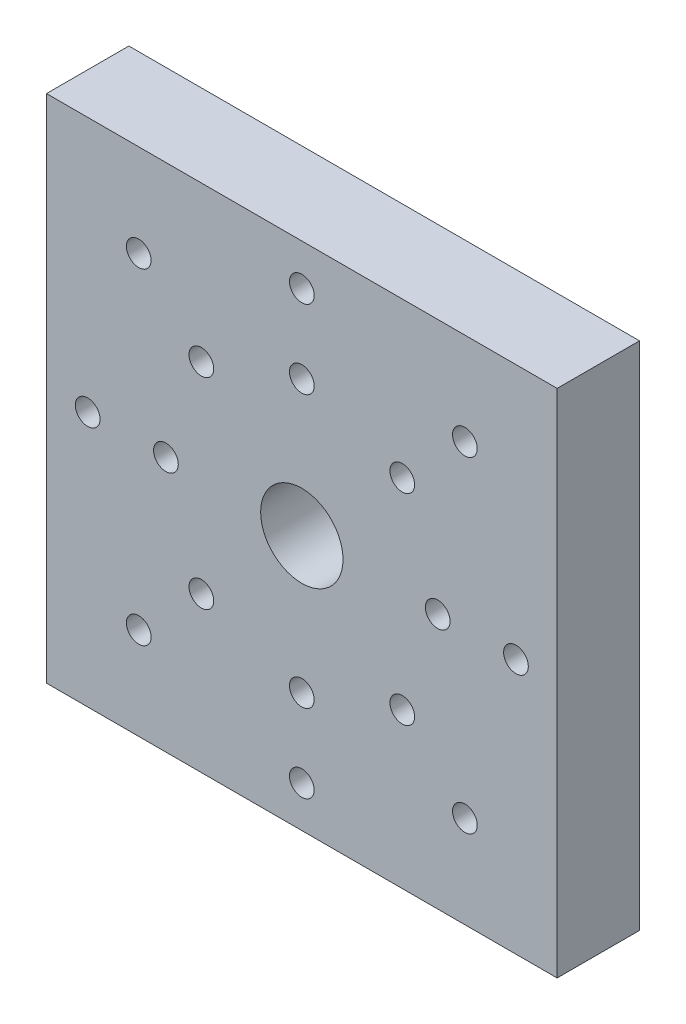
ISO-10303-21;
HEADER;
FILE_DESCRIPTION(('STEP AP214'),'2;1');
FILE_NAME('part.step','',(''),(''),'','','');
FILE_SCHEMA(('AUTOMOTIVE_DESIGN { 1 0 10303 214 1 1 1 1 }'));
ENDSEC;
DATA;
#1=APPLICATION_CONTEXT('core data for automotive mechanical design processes');
#2=APPLICATION_PROTOCOL_DEFINITION('international standard','automotive_design',2000,#1);
#3=PRODUCT_CONTEXT('',#1,'mechanical');
#4=PRODUCT('Part','Part','',(#3));
#5=PRODUCT_RELATED_PRODUCT_CATEGORY('part','',(#4));
#6=PRODUCT_DEFINITION_FORMATION('','',#4);
#7=PRODUCT_DEFINITION_CONTEXT('part definition',#1,'design');
#8=PRODUCT_DEFINITION('design','',#6,#7);
#9=PRODUCT_DEFINITION_SHAPE('','',#8);
#10=(LENGTH_UNIT() NAMED_UNIT(*) SI_UNIT(.MILLI.,.METRE.));
#11=(NAMED_UNIT(*) PLANE_ANGLE_UNIT() SI_UNIT($,.RADIAN.));
#12=(NAMED_UNIT(*) SI_UNIT($,.STERADIAN.) SOLID_ANGLE_UNIT());
#13=UNCERTAINTY_MEASURE_WITH_UNIT(LENGTH_MEASURE(1.E-05),#10,'distance_accuracy_value','');
#14=(GEOMETRIC_REPRESENTATION_CONTEXT(3) GLOBAL_UNCERTAINTY_ASSIGNED_CONTEXT((#13)) GLOBAL_UNIT_ASSIGNED_CONTEXT((#10,
#11,#12)) REPRESENTATION_CONTEXT('',''));
#15=CARTESIAN_POINT('',(0.,0.,0.));
#16=DIRECTION('',(0.,0.,1.));
#17=DIRECTION('',(1.,0.,0.));
#18=AXIS2_PLACEMENT_3D('',#15,#16,#17);
#19=CARTESIAN_POINT('',(0.,0.,10.));
#20=DIRECTION('',(0.,0.,1.));
#21=DIRECTION('',(1.,0.,0.));
#22=AXIS2_PLACEMENT_3D('',#19,#20,#21);
#23=PLANE('',#22);
#24=CARTESIAN_POINT('',(19.7989898732233,-19.7989898732233,10.));
#25=DIRECTION('',(0.,0.,1.));
#26=DIRECTION('',(1.,0.,0.));
#27=AXIS2_PLACEMENT_3D('',#24,#25,#26);
#28=CIRCLE('',#27,1.5);
#29=CARTESIAN_POINT('',(21.2989898732233,-19.7989898732233,10.));
#30=VERTEX_POINT('',#29);
#31=EDGE_CURVE('E206',#30,#30,#28,.F.);
#32=ORIENTED_EDGE('',*,*,#31,.T.);
#33=EDGE_LOOP('',(#32));
#34=FACE_BOUND('',#33,.T.);
#35=CARTESIAN_POINT('',(-19.7989898732233,-19.7989898732233,10.));
#36=DIRECTION('',(0.,0.,1.));
#37=DIRECTION('',(1.,0.,0.));
#38=AXIS2_PLACEMENT_3D('',#35,#36,#37);
#39=CIRCLE('',#38,1.5);
#40=CARTESIAN_POINT('',(-18.2989898732233,-19.7989898732233,10.));
#41=VERTEX_POINT('',#40);
#42=EDGE_CURVE('E213',#41,#41,#39,.F.);
#43=ORIENTED_EDGE('',*,*,#42,.T.);
#44=EDGE_LOOP('',(#43));
#45=FACE_BOUND('',#44,.T.);
#46=CARTESIAN_POINT('',(19.7989898732233,19.7989898732233,10.));
#47=DIRECTION('',(0.,0.,1.));
#48=DIRECTION('',(1.,0.,0.));
#49=AXIS2_PLACEMENT_3D('',#46,#47,#48);
#50=CIRCLE('',#49,1.5);
#51=CARTESIAN_POINT('',(21.2989898732233,19.7989898732233,10.));
#52=VERTEX_POINT('',#51);
#53=EDGE_CURVE('E219',#52,#52,#50,.F.);
#54=ORIENTED_EDGE('',*,*,#53,.T.);
#55=EDGE_LOOP('',(#54));
#56=FACE_BOUND('',#55,.T.);
#57=CARTESIAN_POINT('',(-19.7989898732233,19.7989898732233,10.));
#58=DIRECTION('',(0.,0.,1.));
#59=DIRECTION('',(1.,0.,0.));
#60=AXIS2_PLACEMENT_3D('',#57,#58,#59);
#61=CIRCLE('',#60,1.5);
#62=CARTESIAN_POINT('',(-18.2989898732233,19.7989898732233,10.));
#63=VERTEX_POINT('',#62);
#64=EDGE_CURVE('E205',#63,#63,#61,.F.);
#65=ORIENTED_EDGE('',*,*,#64,.T.);
#66=EDGE_LOOP('',(#65));
#67=FACE_BOUND('',#66,.T.);
#68=CARTESIAN_POINT('',(0.,0.,10.));
#69=DIRECTION('',(0.,0.,1.));
#70=DIRECTION('',(1.,0.,0.));
#71=AXIS2_PLACEMENT_3D('',#68,#69,#70);
#72=CIRCLE('',#71,5.);
#73=CARTESIAN_POINT('',(5.,0.,10.));
#74=VERTEX_POINT('',#73);
#75=EDGE_CURVE('E183',#74,#74,#72,.F.);
#76=ORIENTED_EDGE('',*,*,#75,.T.);
#77=EDGE_LOOP('',(#76));
#78=FACE_BOUND('',#77,.T.);
#79=CARTESIAN_POINT('',(26.,0.,10.));
#80=DIRECTION('',(0.,0.,1.));
#81=DIRECTION('',(1.,0.,0.));
#82=AXIS2_PLACEMENT_3D('',#79,#80,#81);
#83=CIRCLE('',#82,1.5);
#84=CARTESIAN_POINT('',(27.5,0.,10.));
#85=VERTEX_POINT('',#84);
#86=EDGE_CURVE('E173',#85,#85,#83,.F.);
#87=ORIENTED_EDGE('',*,*,#86,.T.);
#88=EDGE_LOOP('',(#87));
#89=FACE_BOUND('',#88,.T.);
#90=CARTESIAN_POINT('',(0.,26.,10.));
#91=DIRECTION('',(0.,0.,1.));
#92=DIRECTION('',(1.,0.,0.));
#93=AXIS2_PLACEMENT_3D('',#90,#91,#92);
#94=CIRCLE('',#93,1.5);
#95=CARTESIAN_POINT('',(1.5,26.,10.));
#96=VERTEX_POINT('',#95);
#97=EDGE_CURVE('E190',#96,#96,#94,.F.);
#98=ORIENTED_EDGE('',*,*,#97,.T.);
#99=EDGE_LOOP('',(#98));
#100=FACE_BOUND('',#99,.T.);
#101=CARTESIAN_POINT('',(-26.,0.,10.));
#102=DIRECTION('',(0.,0.,1.));
#103=DIRECTION('',(1.,0.,0.));
#104=AXIS2_PLACEMENT_3D('',#101,#102,#103);
#105=CIRCLE('',#104,1.5);
#106=CARTESIAN_POINT('',(-24.5,0.,10.));
#107=VERTEX_POINT('',#106);
#108=EDGE_CURVE('E184',#107,#107,#105,.F.);
#109=ORIENTED_EDGE('',*,*,#108,.T.);
#110=EDGE_LOOP('',(#109));
#111=FACE_BOUND('',#110,.T.);
#112=CARTESIAN_POINT('',(0.,-26.,10.));
#113=DIRECTION('',(0.,0.,1.));
#114=DIRECTION('',(1.,0.,0.));
#115=AXIS2_PLACEMENT_3D('',#112,#113,#114);
#116=CIRCLE('',#115,1.5);
#117=CARTESIAN_POINT('',(1.5,-26.,10.));
#118=VERTEX_POINT('',#117);
#119=EDGE_CURVE('E176',#118,#118,#116,.F.);
#120=ORIENTED_EDGE('',*,*,#119,.T.);
#121=EDGE_LOOP('',(#120));
#122=FACE_BOUND('',#121,.T.);
#123=CARTESIAN_POINT('',(12.1975919754679,12.197591975468,10.));
#124=DIRECTION('',(0.,0.,-1.));
#125=DIRECTION('',(-1.,0.,0.));
#126=AXIS2_PLACEMENT_3D('',#123,#124,#125);
#127=CIRCLE('',#126,1.5);
#128=CARTESIAN_POINT('',(10.6975919754679,12.197591975468,10.));
#129=VERTEX_POINT('',#128);
#130=EDGE_CURVE('E155',#129,#129,#127,.T.);
#131=ORIENTED_EDGE('',*,*,#130,.T.);
#132=EDGE_LOOP('',(#131));
#133=FACE_BOUND('',#132,.T.);
#134=CARTESIAN_POINT('',(-12.197591975468,-12.1975919754679,10.));
#135=DIRECTION('',(0.,0.,-1.));
#136=DIRECTION('',(-1.,0.,0.));
#137=AXIS2_PLACEMENT_3D('',#134,#135,#136);
#138=CIRCLE('',#137,1.5);
#139=CARTESIAN_POINT('',(-13.697591975468,-12.1975919754679,10.));
#140=VERTEX_POINT('',#139);
#141=EDGE_CURVE('E161',#140,#140,#138,.T.);
#142=ORIENTED_EDGE('',*,*,#141,.T.);
#143=EDGE_LOOP('',(#142));
#144=FACE_BOUND('',#143,.T.);
#145=CARTESIAN_POINT('',(-12.1975919754679,12.1975919754679,10.));
#146=DIRECTION('',(0.,0.,-1.));
#147=DIRECTION('',(-1.,0.,0.));
#148=AXIS2_PLACEMENT_3D('',#145,#146,#147);
#149=CIRCLE('',#148,1.5);
#150=CARTESIAN_POINT('',(-13.6975919754679,12.1975919754679,10.));
#151=VERTEX_POINT('',#150);
#152=EDGE_CURVE('E162',#151,#151,#149,.T.);
#153=ORIENTED_EDGE('',*,*,#152,.T.);
#154=EDGE_LOOP('',(#153));
#155=FACE_BOUND('',#154,.T.);
#156=CARTESIAN_POINT('',(12.1975919754679,-12.1975919754679,10.));
#157=DIRECTION('',(0.,0.,-1.));
#158=DIRECTION('',(-1.,0.,0.));
#159=AXIS2_PLACEMENT_3D('',#156,#157,#158);
#160=CIRCLE('',#159,1.5);
#161=CARTESIAN_POINT('',(10.6975919754679,-12.1975919754679,10.));
#162=VERTEX_POINT('',#161);
#163=EDGE_CURVE('E149',#162,#162,#160,.T.);
#164=ORIENTED_EDGE('',*,*,#163,.T.);
#165=EDGE_LOOP('',(#164));
#166=FACE_BOUND('',#165,.T.);
#167=CARTESIAN_POINT('',(0.,-16.5,10.));
#168=DIRECTION('',(0.,0.,1.));
#169=DIRECTION('',(1.,0.,0.));
#170=AXIS2_PLACEMENT_3D('',#167,#168,#169);
#171=CIRCLE('',#170,1.5);
#172=CARTESIAN_POINT('',(1.5,-16.5,10.));
#173=VERTEX_POINT('',#172);
#174=EDGE_CURVE('E137',#173,#173,#171,.T.);
#175=ORIENTED_EDGE('',*,*,#174,.F.);
#176=EDGE_LOOP('',(#175));
#177=FACE_BOUND('',#176,.T.);
#178=CARTESIAN_POINT('',(0.,16.5,10.));
#179=DIRECTION('',(0.,0.,1.));
#180=DIRECTION('',(1.,0.,0.));
#181=AXIS2_PLACEMENT_3D('',#178,#179,#180);
#182=CIRCLE('',#181,1.5);
#183=CARTESIAN_POINT('',(1.5,16.5,10.));
#184=VERTEX_POINT('',#183);
#185=EDGE_CURVE('E116',#184,#184,#182,.T.);
#186=ORIENTED_EDGE('',*,*,#185,.F.);
#187=EDGE_LOOP('',(#186));
#188=FACE_BOUND('',#187,.T.);
#189=DIRECTION('',(0.,1.,0.));
#190=VECTOR('',#189,1.);
#191=CARTESIAN_POINT('',(31.,31.,10.));
#192=LINE('',#191,#190);
#193=CARTESIAN_POINT('',(31.,-31.,10.));
#194=VERTEX_POINT('',#193);
#195=CARTESIAN_POINT('',(31.,31.,10.));
#196=VERTEX_POINT('',#195);
#197=EDGE_CURVE('E101',#194,#196,#192,.T.);
#198=ORIENTED_EDGE('',*,*,#197,.T.);
#199=DIRECTION('',(-1.,0.,0.));
#200=VECTOR('',#199,1.);
#201=CARTESIAN_POINT('',(-31.,31.,10.));
#202=LINE('',#201,#200);
#203=CARTESIAN_POINT('',(-31.,31.,10.));
#204=VERTEX_POINT('',#203);
#205=EDGE_CURVE('E96',#196,#204,#202,.T.);
#206=ORIENTED_EDGE('',*,*,#205,.T.);
#207=DIRECTION('',(0.,-1.,0.));
#208=VECTOR('',#207,1.);
#209=CARTESIAN_POINT('',(-31.,31.,10.));
#210=LINE('',#209,#208);
#211=CARTESIAN_POINT('',(-31.,-31.,10.));
#212=VERTEX_POINT('',#211);
#213=EDGE_CURVE('E99',#204,#212,#210,.T.);
#214=ORIENTED_EDGE('',*,*,#213,.T.);
#215=DIRECTION('',(1.,0.,0.));
#216=VECTOR('',#215,1.);
#217=CARTESIAN_POINT('',(-31.,-31.,10.));
#218=LINE('',#217,#216);
#219=EDGE_CURVE('E66',#212,#194,#218,.T.);
#220=ORIENTED_EDGE('',*,*,#219,.T.);
#221=EDGE_LOOP('',(#198,#206,#214,#220));
#222=FACE_BOUND('',#221,.T.);
#223=CARTESIAN_POINT('',(16.5,0.,10.));
#224=DIRECTION('',(0.,0.,1.));
#225=DIRECTION('',(1.,0.,0.));
#226=AXIS2_PLACEMENT_3D('',#223,#224,#225);
#227=CIRCLE('',#226,1.5);
#228=CARTESIAN_POINT('',(18.,0.,10.));
#229=VERTEX_POINT('',#228);
#230=EDGE_CURVE('E131',#229,#229,#227,.T.);
#231=ORIENTED_EDGE('',*,*,#230,.F.);
#232=EDGE_LOOP('',(#231));
#233=FACE_BOUND('',#232,.T.);
#234=CARTESIAN_POINT('',(-16.5,0.,10.));
#235=DIRECTION('',(0.,0.,1.));
#236=DIRECTION('',(1.,0.,0.));
#237=AXIS2_PLACEMENT_3D('',#234,#235,#236);
#238=CIRCLE('',#237,1.5);
#239=CARTESIAN_POINT('',(-15.,0.,10.));
#240=VERTEX_POINT('',#239);
#241=EDGE_CURVE('E143',#240,#240,#238,.T.);
#242=ORIENTED_EDGE('',*,*,#241,.F.);
#243=EDGE_LOOP('',(#242));
#244=FACE_BOUND('',#243,.T.);
#245=ADVANCED_FACE('F49',(#34,#45,#56,#67,#78,#89,#100,#111,#122,#133,#144,#155,#166,#177,#188,
#222,#233,#244),#23,.T.);
#246=CARTESIAN_POINT('',(0.,0.,0.));
#247=DIRECTION('',(0.,0.,1.));
#248=DIRECTION('',(1.,0.,0.));
#249=AXIS2_PLACEMENT_3D('',#246,#247,#248);
#250=PLANE('',#249);
#251=CARTESIAN_POINT('',(19.7989898732233,-19.7989898732233,0.));
#252=DIRECTION('',(0.,0.,-1.));
#253=DIRECTION('',(-1.,0.,0.));
#254=AXIS2_PLACEMENT_3D('',#251,#252,#253);
#255=CIRCLE('',#254,1.5);
#256=CARTESIAN_POINT('',(18.2989898732233,-19.7989898732233,0.));
#257=VERTEX_POINT('',#256);
#258=EDGE_CURVE('E210',#257,#257,#255,.T.);
#259=ORIENTED_EDGE('',*,*,#258,.F.);
#260=EDGE_LOOP('',(#259));
#261=FACE_BOUND('',#260,.T.);
#262=CARTESIAN_POINT('',(-19.7989898732233,-19.7989898732233,0.));
#263=DIRECTION('',(0.,0.,-1.));
#264=DIRECTION('',(-1.,0.,0.));
#265=AXIS2_PLACEMENT_3D('',#262,#263,#264);
#266=CIRCLE('',#265,1.5);
#267=CARTESIAN_POINT('',(-21.2989898732233,-19.7989898732233,0.));
#268=VERTEX_POINT('',#267);
#269=EDGE_CURVE('E209',#268,#268,#266,.T.);
#270=ORIENTED_EDGE('',*,*,#269,.F.);
#271=EDGE_LOOP('',(#270));
#272=FACE_BOUND('',#271,.T.);
#273=CARTESIAN_POINT('',(19.7989898732233,19.7989898732233,0.));
#274=DIRECTION('',(0.,0.,-1.));
#275=DIRECTION('',(-1.,0.,0.));
#276=AXIS2_PLACEMENT_3D('',#273,#274,#275);
#277=CIRCLE('',#276,1.5);
#278=CARTESIAN_POINT('',(18.2989898732233,19.7989898732233,0.));
#279=VERTEX_POINT('',#278);
#280=EDGE_CURVE('E216',#279,#279,#277,.T.);
#281=ORIENTED_EDGE('',*,*,#280,.F.);
#282=EDGE_LOOP('',(#281));
#283=FACE_BOUND('',#282,.T.);
#284=CARTESIAN_POINT('',(-19.7989898732233,19.7989898732233,0.));
#285=DIRECTION('',(0.,0.,-1.));
#286=DIRECTION('',(-1.,0.,0.));
#287=AXIS2_PLACEMENT_3D('',#284,#285,#286);
#288=CIRCLE('',#287,1.5);
#289=CARTESIAN_POINT('',(-21.2989898732233,19.7989898732233,0.));
#290=VERTEX_POINT('',#289);
#291=EDGE_CURVE('E222',#290,#290,#288,.T.);
#292=ORIENTED_EDGE('',*,*,#291,.F.);
#293=EDGE_LOOP('',(#292));
#294=FACE_BOUND('',#293,.T.);
#295=CARTESIAN_POINT('',(0.,0.,0.));
#296=DIRECTION('',(0.,0.,-1.));
#297=DIRECTION('',(-1.,0.,0.));
#298=AXIS2_PLACEMENT_3D('',#295,#296,#297);
#299=CIRCLE('',#298,5.);
#300=CARTESIAN_POINT('',(-5.,0.,0.));
#301=VERTEX_POINT('',#300);
#302=EDGE_CURVE('E202',#301,#301,#299,.T.);
#303=ORIENTED_EDGE('',*,*,#302,.F.);
#304=EDGE_LOOP('',(#303));
#305=FACE_BOUND('',#304,.T.);
#306=CARTESIAN_POINT('',(26.,0.,0.));
#307=DIRECTION('',(0.,0.,-1.));
#308=DIRECTION('',(-1.,0.,0.));
#309=AXIS2_PLACEMENT_3D('',#306,#307,#308);
#310=CIRCLE('',#309,1.5);
#311=CARTESIAN_POINT('',(24.5,0.,0.));
#312=VERTEX_POINT('',#311);
#313=EDGE_CURVE('E193',#312,#312,#310,.T.);
#314=ORIENTED_EDGE('',*,*,#313,.F.);
#315=EDGE_LOOP('',(#314));
#316=FACE_BOUND('',#315,.T.);
#317=CARTESIAN_POINT('',(0.,26.,0.));
#318=DIRECTION('',(0.,0.,-1.));
#319=DIRECTION('',(-1.,0.,0.));
#320=AXIS2_PLACEMENT_3D('',#317,#318,#319);
#321=CIRCLE('',#320,1.5);
#322=CARTESIAN_POINT('',(-1.5,26.,0.));
#323=VERTEX_POINT('',#322);
#324=EDGE_CURVE('E187',#323,#323,#321,.T.);
#325=ORIENTED_EDGE('',*,*,#324,.F.);
#326=EDGE_LOOP('',(#325));
#327=FACE_BOUND('',#326,.T.);
#328=CARTESIAN_POINT('',(-26.,0.,0.));
#329=DIRECTION('',(0.,0.,-1.));
#330=DIRECTION('',(-1.,0.,0.));
#331=AXIS2_PLACEMENT_3D('',#328,#329,#330);
#332=CIRCLE('',#331,1.5);
#333=CARTESIAN_POINT('',(-27.5,0.,0.));
#334=VERTEX_POINT('',#333);
#335=EDGE_CURVE('E179',#334,#334,#332,.T.);
#336=ORIENTED_EDGE('',*,*,#335,.F.);
#337=EDGE_LOOP('',(#336));
#338=FACE_BOUND('',#337,.T.);
#339=CARTESIAN_POINT('',(0.,-26.,0.));
#340=DIRECTION('',(0.,0.,-1.));
#341=DIRECTION('',(-1.,0.,0.));
#342=AXIS2_PLACEMENT_3D('',#339,#340,#341);
#343=CIRCLE('',#342,1.5);
#344=CARTESIAN_POINT('',(-1.5,-26.,0.));
#345=VERTEX_POINT('',#344);
#346=EDGE_CURVE('E180',#345,#345,#343,.T.);
#347=ORIENTED_EDGE('',*,*,#346,.F.);
#348=EDGE_LOOP('',(#347));
#349=FACE_BOUND('',#348,.T.);
#350=CARTESIAN_POINT('',(12.1975919754679,12.197591975468,0.));
#351=DIRECTION('',(0.,0.,-1.));
#352=DIRECTION('',(-1.,0.,0.));
#353=AXIS2_PLACEMENT_3D('',#350,#351,#352);
#354=CIRCLE('',#353,1.5);
#355=CARTESIAN_POINT('',(10.6975919754679,12.197591975468,0.));
#356=VERTEX_POINT('',#355);
#357=EDGE_CURVE('E165',#356,#356,#354,.T.);
#358=ORIENTED_EDGE('',*,*,#357,.F.);
#359=EDGE_LOOP('',(#358));
#360=FACE_BOUND('',#359,.T.);
#361=CARTESIAN_POINT('',(-12.197591975468,-12.1975919754679,0.));
#362=DIRECTION('',(0.,0.,-1.));
#363=DIRECTION('',(-1.,0.,0.));
#364=AXIS2_PLACEMENT_3D('',#361,#362,#363);
#365=CIRCLE('',#364,1.5);
#366=CARTESIAN_POINT('',(-13.697591975468,-12.1975919754679,0.));
#367=VERTEX_POINT('',#366);
#368=EDGE_CURVE('E158',#367,#367,#365,.T.);
#369=ORIENTED_EDGE('',*,*,#368,.F.);
#370=EDGE_LOOP('',(#369));
#371=FACE_BOUND('',#370,.T.);
#372=CARTESIAN_POINT('',(-12.1975919754679,12.1975919754679,0.));
#373=DIRECTION('',(0.,0.,-1.));
#374=DIRECTION('',(-1.,0.,0.));
#375=AXIS2_PLACEMENT_3D('',#372,#373,#374);
#376=CIRCLE('',#375,1.5);
#377=CARTESIAN_POINT('',(-13.6975919754679,12.1975919754679,0.));
#378=VERTEX_POINT('',#377);
#379=EDGE_CURVE('E170',#378,#378,#376,.T.);
#380=ORIENTED_EDGE('',*,*,#379,.F.);
#381=EDGE_LOOP('',(#380));
#382=FACE_BOUND('',#381,.T.);
#383=CARTESIAN_POINT('',(12.1975919754679,-12.1975919754679,0.));
#384=DIRECTION('',(0.,0.,-1.));
#385=DIRECTION('',(-1.,0.,0.));
#386=AXIS2_PLACEMENT_3D('',#383,#384,#385);
#387=CIRCLE('',#386,1.5);
#388=CARTESIAN_POINT('',(10.6975919754679,-12.1975919754679,0.));
#389=VERTEX_POINT('',#388);
#390=EDGE_CURVE('E152',#389,#389,#387,.T.);
#391=ORIENTED_EDGE('',*,*,#390,.F.);
#392=EDGE_LOOP('',(#391));
#393=FACE_BOUND('',#392,.T.);
#394=DIRECTION('',(0.,1.,0.));
#395=VECTOR('',#394,1.);
#396=CARTESIAN_POINT('',(31.,31.,0.));
#397=LINE('',#396,#395);
#398=CARTESIAN_POINT('',(31.,-31.,0.));
#399=VERTEX_POINT('',#398);
#400=CARTESIAN_POINT('',(31.,31.,0.));
#401=VERTEX_POINT('',#400);
#402=EDGE_CURVE('E113',#399,#401,#397,.T.);
#403=ORIENTED_EDGE('',*,*,#402,.F.);
#404=DIRECTION('',(1.,0.,0.));
#405=VECTOR('',#404,1.);
#406=CARTESIAN_POINT('',(-31.,-31.,0.));
#407=LINE('',#406,#405);
#408=CARTESIAN_POINT('',(-31.,-31.,0.));
#409=VERTEX_POINT('',#408);
#410=EDGE_CURVE('E89',#409,#399,#407,.T.);
#411=ORIENTED_EDGE('',*,*,#410,.F.);
#412=DIRECTION('',(0.,-1.,0.));
#413=VECTOR('',#412,1.);
#414=CARTESIAN_POINT('',(-31.,31.,0.));
#415=LINE('',#414,#413);
#416=CARTESIAN_POINT('',(-31.,31.,0.));
#417=VERTEX_POINT('',#416);
#418=EDGE_CURVE('E83',#417,#409,#415,.T.);
#419=ORIENTED_EDGE('',*,*,#418,.F.);
#420=DIRECTION('',(-1.,0.,0.));
#421=VECTOR('',#420,1.);
#422=CARTESIAN_POINT('',(-31.,31.,0.));
#423=LINE('',#422,#421);
#424=EDGE_CURVE('E105',#401,#417,#423,.T.);
#425=ORIENTED_EDGE('',*,*,#424,.F.);
#426=EDGE_LOOP('',(#403,#411,#419,#425));
#427=FACE_BOUND('',#426,.T.);
#428=CARTESIAN_POINT('',(0.,16.5,0.));
#429=DIRECTION('',(0.,0.,1.));
#430=DIRECTION('',(1.,0.,0.));
#431=AXIS2_PLACEMENT_3D('',#428,#429,#430);
#432=CIRCLE('',#431,1.5);
#433=CARTESIAN_POINT('',(1.5,16.5,0.));
#434=VERTEX_POINT('',#433);
#435=EDGE_CURVE('E128',#434,#434,#432,.T.);
#436=ORIENTED_EDGE('',*,*,#435,.T.);
#437=EDGE_LOOP('',(#436));
#438=FACE_BOUND('',#437,.T.);
#439=CARTESIAN_POINT('',(16.5,0.,0.));
#440=DIRECTION('',(0.,0.,1.));
#441=DIRECTION('',(1.,0.,0.));
#442=AXIS2_PLACEMENT_3D('',#439,#440,#441);
#443=CIRCLE('',#442,1.5);
#444=CARTESIAN_POINT('',(18.,0.,0.));
#445=VERTEX_POINT('',#444);
#446=EDGE_CURVE('E134',#445,#445,#443,.T.);
#447=ORIENTED_EDGE('',*,*,#446,.T.);
#448=EDGE_LOOP('',(#447));
#449=FACE_BOUND('',#448,.T.);
#450=CARTESIAN_POINT('',(0.,-16.5,0.));
#451=DIRECTION('',(0.,0.,1.));
#452=DIRECTION('',(1.,0.,0.));
#453=AXIS2_PLACEMENT_3D('',#450,#451,#452);
#454=CIRCLE('',#453,1.5);
#455=CARTESIAN_POINT('',(1.5,-16.5,0.));
#456=VERTEX_POINT('',#455);
#457=EDGE_CURVE('E140',#456,#456,#454,.T.);
#458=ORIENTED_EDGE('',*,*,#457,.T.);
#459=EDGE_LOOP('',(#458));
#460=FACE_BOUND('',#459,.T.);
#461=CARTESIAN_POINT('',(-16.5,0.,0.));
#462=DIRECTION('',(0.,0.,1.));
#463=DIRECTION('',(1.,0.,0.));
#464=AXIS2_PLACEMENT_3D('',#461,#462,#463);
#465=CIRCLE('',#464,1.5);
#466=CARTESIAN_POINT('',(-15.,0.,0.));
#467=VERTEX_POINT('',#466);
#468=EDGE_CURVE('E146',#467,#467,#465,.T.);
#469=ORIENTED_EDGE('',*,*,#468,.T.);
#470=EDGE_LOOP('',(#469));
#471=FACE_BOUND('',#470,.T.);
#472=ADVANCED_FACE('F124',(#261,#272,#283,#294,#305,#316,#327,#338,#349,#360,#371,#382,#393,
#427,#438,#449,#460,#471),#250,.F.);
#473=CARTESIAN_POINT('',(31.,31.,10.));
#474=DIRECTION('',(-1.,0.,0.));
#475=DIRECTION('',(0.,-1.,0.));
#476=AXIS2_PLACEMENT_3D('',#473,#474,#475);
#477=PLANE('',#476);
#478=ORIENTED_EDGE('',*,*,#402,.T.);
#479=DIRECTION('',(0.,0.,-1.));
#480=VECTOR('',#479,1.);
#481=CARTESIAN_POINT('',(31.,31.,10.));
#482=LINE('',#481,#480);
#483=EDGE_CURVE('E13',#196,#401,#482,.T.);
#484=ORIENTED_EDGE('',*,*,#483,.F.);
#485=ORIENTED_EDGE('',*,*,#197,.F.);
#486=DIRECTION('',(0.,0.,-1.));
#487=VECTOR('',#486,1.);
#488=CARTESIAN_POINT('',(31.,-31.,10.));
#489=LINE('',#488,#487);
#490=EDGE_CURVE('E109',#194,#399,#489,.T.);
#491=ORIENTED_EDGE('',*,*,#490,.T.);
#492=EDGE_LOOP('',(#478,#484,#485,#491));
#493=FACE_BOUND('',#492,.T.);
#494=ADVANCED_FACE('F51',(#493),#477,.F.);
#495=CARTESIAN_POINT('',(-31.,31.,10.));
#496=DIRECTION('',(0.,-1.,0.));
#497=DIRECTION('',(0.,0.,-1.));
#498=AXIS2_PLACEMENT_3D('',#495,#496,#497);
#499=PLANE('',#498);
#500=ORIENTED_EDGE('',*,*,#424,.T.);
#501=DIRECTION('',(0.,0.,-1.));
#502=VECTOR('',#501,1.);
#503=CARTESIAN_POINT('',(-31.,31.,10.));
#504=LINE('',#503,#502);
#505=EDGE_CURVE('E58',#204,#417,#504,.T.);
#506=ORIENTED_EDGE('',*,*,#505,.F.);
#507=ORIENTED_EDGE('',*,*,#205,.F.);
#508=ORIENTED_EDGE('',*,*,#483,.T.);
#509=EDGE_LOOP('',(#500,#506,#507,#508));
#510=FACE_BOUND('',#509,.T.);
#511=ADVANCED_FACE('F104',(#510),#499,.F.);
#512=CARTESIAN_POINT('',(-31.,31.,10.));
#513=DIRECTION('',(1.,0.,0.));
#514=DIRECTION('',(0.,1.,0.));
#515=AXIS2_PLACEMENT_3D('',#512,#513,#514);
#516=PLANE('',#515);
#517=ORIENTED_EDGE('',*,*,#418,.T.);
#518=DIRECTION('',(0.,0.,-1.));
#519=VECTOR('',#518,1.);
#520=CARTESIAN_POINT('',(-31.,-31.,10.));
#521=LINE('',#520,#519);
#522=EDGE_CURVE('E106',#212,#409,#521,.T.);
#523=ORIENTED_EDGE('',*,*,#522,.F.);
#524=ORIENTED_EDGE('',*,*,#213,.F.);
#525=ORIENTED_EDGE('',*,*,#505,.T.);
#526=EDGE_LOOP('',(#517,#523,#524,#525));
#527=FACE_BOUND('',#526,.T.);
#528=ADVANCED_FACE('F107',(#527),#516,.F.);
#529=CARTESIAN_POINT('',(-31.,-31.,10.));
#530=DIRECTION('',(0.,1.,0.));
#531=DIRECTION('',(0.,0.,1.));
#532=AXIS2_PLACEMENT_3D('',#529,#530,#531);
#533=PLANE('',#532);
#534=ORIENTED_EDGE('',*,*,#410,.T.);
#535=ORIENTED_EDGE('',*,*,#490,.F.);
#536=ORIENTED_EDGE('',*,*,#219,.F.);
#537=ORIENTED_EDGE('',*,*,#522,.T.);
#538=EDGE_LOOP('',(#534,#535,#536,#537));
#539=FACE_BOUND('',#538,.T.);
#540=ADVANCED_FACE('F121',(#539),#533,.F.);
#541=CARTESIAN_POINT('',(0.,16.5,10.));
#542=DIRECTION('',(0.,0.,-1.));
#543=DIRECTION('',(-1.,0.,0.));
#544=AXIS2_PLACEMENT_3D('',#541,#542,#543);
#545=CYLINDRICAL_SURFACE('',#544,1.5);
#546=ORIENTED_EDGE('',*,*,#185,.T.);
#547=EDGE_LOOP('',(#546));
#548=FACE_BOUND('',#547,.T.);
#549=ORIENTED_EDGE('',*,*,#435,.F.);
#550=EDGE_LOOP('',(#549));
#551=FACE_BOUND('',#550,.T.);
#552=ADVANCED_FACE('F280',(#548,#551),#545,.F.);
#553=CARTESIAN_POINT('',(16.5,0.,10.));
#554=DIRECTION('',(0.,0.,-1.));
#555=DIRECTION('',(-1.,0.,0.));
#556=AXIS2_PLACEMENT_3D('',#553,#554,#555);
#557=CYLINDRICAL_SURFACE('',#556,1.5);
#558=ORIENTED_EDGE('',*,*,#230,.T.);
#559=EDGE_LOOP('',(#558));
#560=FACE_BOUND('',#559,.T.);
#561=ORIENTED_EDGE('',*,*,#446,.F.);
#562=EDGE_LOOP('',(#561));
#563=FACE_BOUND('',#562,.T.);
#564=ADVANCED_FACE('F390',(#560,#563),#557,.F.);
#565=CARTESIAN_POINT('',(0.,-16.5,10.));
#566=DIRECTION('',(0.,0.,-1.));
#567=DIRECTION('',(-1.,0.,0.));
#568=AXIS2_PLACEMENT_3D('',#565,#566,#567);
#569=CYLINDRICAL_SURFACE('',#568,1.5);
#570=ORIENTED_EDGE('',*,*,#174,.T.);
#571=EDGE_LOOP('',(#570));
#572=FACE_BOUND('',#571,.T.);
#573=ORIENTED_EDGE('',*,*,#457,.F.);
#574=EDGE_LOOP('',(#573));
#575=FACE_BOUND('',#574,.T.);
#576=ADVANCED_FACE('F268',(#572,#575),#569,.F.);
#577=CARTESIAN_POINT('',(-16.5,0.,10.));
#578=DIRECTION('',(0.,0.,-1.));
#579=DIRECTION('',(-1.,0.,0.));
#580=AXIS2_PLACEMENT_3D('',#577,#578,#579);
#581=CYLINDRICAL_SURFACE('',#580,1.5);
#582=ORIENTED_EDGE('',*,*,#241,.T.);
#583=EDGE_LOOP('',(#582));
#584=FACE_BOUND('',#583,.T.);
#585=ORIENTED_EDGE('',*,*,#468,.F.);
#586=EDGE_LOOP('',(#585));
#587=FACE_BOUND('',#586,.T.);
#588=ADVANCED_FACE('F258',(#584,#587),#581,.F.);
#589=CARTESIAN_POINT('',(12.1975919754679,-12.1975919754679,10.));
#590=DIRECTION('',(0.,0.,-1.));
#591=DIRECTION('',(-1.,0.,0.));
#592=AXIS2_PLACEMENT_3D('',#589,#590,#591);
#593=CYLINDRICAL_SURFACE('',#592,1.5);
#594=ORIENTED_EDGE('',*,*,#163,.F.);
#595=EDGE_LOOP('',(#594));
#596=FACE_BOUND('',#595,.T.);
#597=ORIENTED_EDGE('',*,*,#390,.T.);
#598=EDGE_LOOP('',(#597));
#599=FACE_BOUND('',#598,.T.);
#600=ADVANCED_FACE('F255',(#596,#599),#593,.F.);
#601=CARTESIAN_POINT('',(-12.1975919754679,12.1975919754679,10.));
#602=DIRECTION('',(0.,0.,-1.));
#603=DIRECTION('',(-1.,0.,0.));
#604=AXIS2_PLACEMENT_3D('',#601,#602,#603);
#605=CYLINDRICAL_SURFACE('',#604,1.5);
#606=ORIENTED_EDGE('',*,*,#152,.F.);
#607=EDGE_LOOP('',(#606));
#608=FACE_BOUND('',#607,.T.);
#609=ORIENTED_EDGE('',*,*,#379,.T.);
#610=EDGE_LOOP('',(#609));
#611=FACE_BOUND('',#610,.T.);
#612=ADVANCED_FACE('F257',(#608,#611),#605,.F.);
#613=CARTESIAN_POINT('',(-12.197591975468,-12.1975919754679,10.));
#614=DIRECTION('',(0.,0.,-1.));
#615=DIRECTION('',(-1.,0.,0.));
#616=AXIS2_PLACEMENT_3D('',#613,#614,#615);
#617=CYLINDRICAL_SURFACE('',#616,1.5);
#618=ORIENTED_EDGE('',*,*,#141,.F.);
#619=EDGE_LOOP('',(#618));
#620=FACE_BOUND('',#619,.T.);
#621=ORIENTED_EDGE('',*,*,#368,.T.);
#622=EDGE_LOOP('',(#621));
#623=FACE_BOUND('',#622,.T.);
#624=ADVANCED_FACE('F265',(#620,#623),#617,.F.);
#625=CARTESIAN_POINT('',(12.1975919754679,12.197591975468,10.));
#626=DIRECTION('',(0.,0.,-1.));
#627=DIRECTION('',(-1.,0.,0.));
#628=AXIS2_PLACEMENT_3D('',#625,#626,#627);
#629=CYLINDRICAL_SURFACE('',#628,1.5);
#630=ORIENTED_EDGE('',*,*,#130,.F.);
#631=EDGE_LOOP('',(#630));
#632=FACE_BOUND('',#631,.T.);
#633=ORIENTED_EDGE('',*,*,#357,.T.);
#634=EDGE_LOOP('',(#633));
#635=FACE_BOUND('',#634,.T.);
#636=ADVANCED_FACE('F368',(#632,#635),#629,.F.);
#637=CARTESIAN_POINT('',(0.,-26.,14.2426406871193));
#638=DIRECTION('',(0.,0.,-1.));
#639=DIRECTION('',(-1.,0.,0.));
#640=AXIS2_PLACEMENT_3D('',#637,#638,#639);
#641=CYLINDRICAL_SURFACE('',#640,1.5);
#642=ORIENTED_EDGE('',*,*,#346,.T.);
#643=EDGE_LOOP('',(#642));
#644=FACE_BOUND('',#643,.T.);
#645=ORIENTED_EDGE('',*,*,#119,.F.);
#646=EDGE_LOOP('',(#645));
#647=FACE_BOUND('',#646,.T.);
#648=ADVANCED_FACE('F365',(#644,#647),#641,.F.);
#649=CARTESIAN_POINT('',(-26.,0.,14.2426406871193));
#650=DIRECTION('',(0.,0.,-1.));
#651=DIRECTION('',(-1.,0.,0.));
#652=AXIS2_PLACEMENT_3D('',#649,#650,#651);
#653=CYLINDRICAL_SURFACE('',#652,1.5);
#654=ORIENTED_EDGE('',*,*,#335,.T.);
#655=EDGE_LOOP('',(#654));
#656=FACE_BOUND('',#655,.T.);
#657=ORIENTED_EDGE('',*,*,#108,.F.);
#658=EDGE_LOOP('',(#657));
#659=FACE_BOUND('',#658,.T.);
#660=ADVANCED_FACE('F361',(#656,#659),#653,.F.);
#661=CARTESIAN_POINT('',(0.,26.,14.2426406871193));
#662=DIRECTION('',(0.,0.,-1.));
#663=DIRECTION('',(-1.,0.,0.));
#664=AXIS2_PLACEMENT_3D('',#661,#662,#663);
#665=CYLINDRICAL_SURFACE('',#664,1.5);
#666=ORIENTED_EDGE('',*,*,#324,.T.);
#667=EDGE_LOOP('',(#666));
#668=FACE_BOUND('',#667,.T.);
#669=ORIENTED_EDGE('',*,*,#97,.F.);
#670=EDGE_LOOP('',(#669));
#671=FACE_BOUND('',#670,.T.);
#672=ADVANCED_FACE('F357',(#668,#671),#665,.F.);
#673=CARTESIAN_POINT('',(26.,0.,14.2426406871193));
#674=DIRECTION('',(0.,0.,-1.));
#675=DIRECTION('',(-1.,0.,0.));
#676=AXIS2_PLACEMENT_3D('',#673,#674,#675);
#677=CYLINDRICAL_SURFACE('',#676,1.5);
#678=ORIENTED_EDGE('',*,*,#313,.T.);
#679=EDGE_LOOP('',(#678));
#680=FACE_BOUND('',#679,.T.);
#681=ORIENTED_EDGE('',*,*,#86,.F.);
#682=EDGE_LOOP('',(#681));
#683=FACE_BOUND('',#682,.T.);
#684=ADVANCED_FACE('F309',(#680,#683),#677,.F.);
#685=CARTESIAN_POINT('',(0.,0.,24.142135623731));
#686=DIRECTION('',(0.,0.,-1.));
#687=DIRECTION('',(-1.,0.,0.));
#688=AXIS2_PLACEMENT_3D('',#685,#686,#687);
#689=CYLINDRICAL_SURFACE('',#688,5.);
#690=ORIENTED_EDGE('',*,*,#302,.T.);
#691=EDGE_LOOP('',(#690));
#692=FACE_BOUND('',#691,.T.);
#693=ORIENTED_EDGE('',*,*,#75,.F.);
#694=EDGE_LOOP('',(#693));
#695=FACE_BOUND('',#694,.T.);
#696=ADVANCED_FACE('F304',(#692,#695),#689,.F.);
#697=CARTESIAN_POINT('',(-19.7989898732233,19.7989898732233,24.142135623731));
#698=DIRECTION('',(0.,0.,-1.));
#699=DIRECTION('',(-1.,0.,0.));
#700=AXIS2_PLACEMENT_3D('',#697,#698,#699);
#701=CYLINDRICAL_SURFACE('',#700,1.5);
#702=ORIENTED_EDGE('',*,*,#291,.T.);
#703=EDGE_LOOP('',(#702));
#704=FACE_BOUND('',#703,.T.);
#705=ORIENTED_EDGE('',*,*,#64,.F.);
#706=EDGE_LOOP('',(#705));
#707=FACE_BOUND('',#706,.T.);
#708=ADVANCED_FACE('F230',(#704,#707),#701,.F.);
#709=CARTESIAN_POINT('',(19.7989898732233,19.7989898732233,24.142135623731));
#710=DIRECTION('',(0.,0.,-1.));
#711=DIRECTION('',(-1.,0.,0.));
#712=AXIS2_PLACEMENT_3D('',#709,#710,#711);
#713=CYLINDRICAL_SURFACE('',#712,1.5);
#714=ORIENTED_EDGE('',*,*,#280,.T.);
#715=EDGE_LOOP('',(#714));
#716=FACE_BOUND('',#715,.T.);
#717=ORIENTED_EDGE('',*,*,#53,.F.);
#718=EDGE_LOOP('',(#717));
#719=FACE_BOUND('',#718,.T.);
#720=ADVANCED_FACE('F321',(#716,#719),#713,.F.);
#721=CARTESIAN_POINT('',(-19.7989898732233,-19.7989898732233,24.142135623731));
#722=DIRECTION('',(0.,0.,-1.));
#723=DIRECTION('',(-1.,0.,0.));
#724=AXIS2_PLACEMENT_3D('',#721,#722,#723);
#725=CYLINDRICAL_SURFACE('',#724,1.5);
#726=ORIENTED_EDGE('',*,*,#269,.T.);
#727=EDGE_LOOP('',(#726));
#728=FACE_BOUND('',#727,.T.);
#729=ORIENTED_EDGE('',*,*,#42,.F.);
#730=EDGE_LOOP('',(#729));
#731=FACE_BOUND('',#730,.T.);
#732=ADVANCED_FACE('F330',(#728,#731),#725,.F.);
#733=CARTESIAN_POINT('',(19.7989898732233,-19.7989898732233,24.142135623731));
#734=DIRECTION('',(0.,0.,-1.));
#735=DIRECTION('',(-1.,0.,0.));
#736=AXIS2_PLACEMENT_3D('',#733,#734,#735);
#737=CYLINDRICAL_SURFACE('',#736,1.5);
#738=ORIENTED_EDGE('',*,*,#258,.T.);
#739=EDGE_LOOP('',(#738));
#740=FACE_BOUND('',#739,.T.);
#741=ORIENTED_EDGE('',*,*,#31,.F.);
#742=EDGE_LOOP('',(#741));
#743=FACE_BOUND('',#742,.T.);
#744=ADVANCED_FACE('F340',(#740,#743),#737,.F.);
#745=CLOSED_SHELL('',(#245,#472,#494,#511,#528,#540,#552,#564,#576,#588,#600,#612,#624,#636,
#648,#660,#672,#684,#696,#708,#720,#732,#744));
#746=MANIFOLD_SOLID_BREP('B2',#745);
#747=ADVANCED_BREP_SHAPE_REPRESENTATION('',(#18,#746),#14);
#748=SHAPE_DEFINITION_REPRESENTATION(#9,#747);
ENDSEC;
END-ISO-10303-21;
